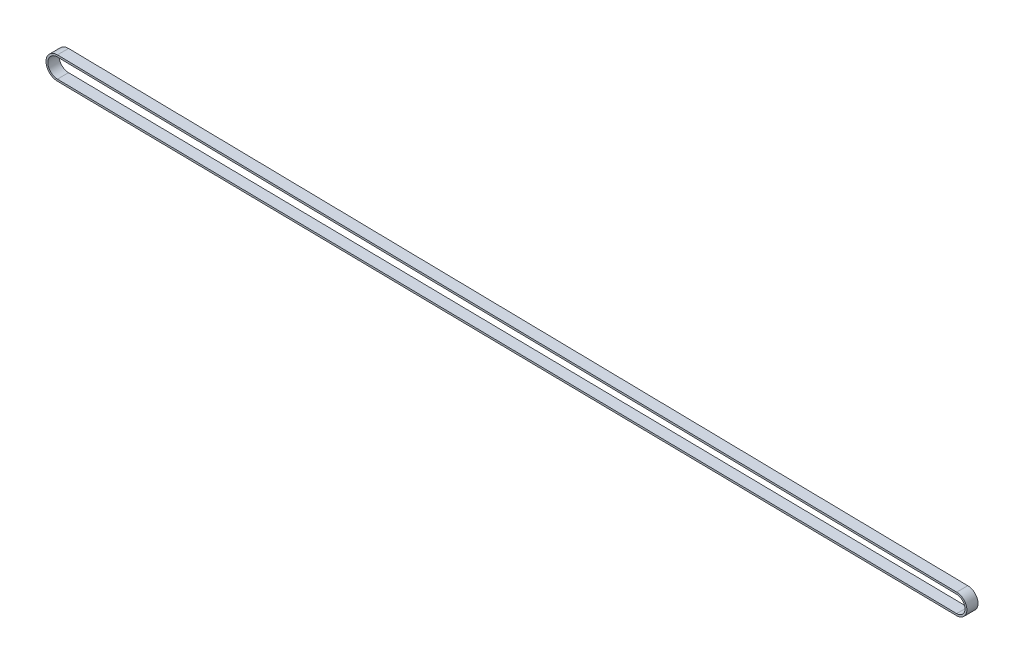
ISO-10303-21;
HEADER;
FILE_DESCRIPTION(('STEP AP214'),'2;1');
FILE_NAME('part.step','',(''),(''),'','','');
FILE_SCHEMA(('AUTOMOTIVE_DESIGN { 1 0 10303 214 1 1 1 1 }'));
ENDSEC;
DATA;
#1=APPLICATION_CONTEXT('core data for automotive mechanical design processes');
#2=APPLICATION_PROTOCOL_DEFINITION('international standard','automotive_design',2000,#1);
#3=PRODUCT_CONTEXT('',#1,'mechanical');
#4=PRODUCT('Part','Part','',(#3));
#5=PRODUCT_RELATED_PRODUCT_CATEGORY('part','',(#4));
#6=PRODUCT_DEFINITION_FORMATION('','',#4);
#7=PRODUCT_DEFINITION_CONTEXT('part definition',#1,'design');
#8=PRODUCT_DEFINITION('design','',#6,#7);
#9=PRODUCT_DEFINITION_SHAPE('','',#8);
#10=(LENGTH_UNIT() NAMED_UNIT(*) SI_UNIT(.MILLI.,.METRE.));
#11=(NAMED_UNIT(*) PLANE_ANGLE_UNIT() SI_UNIT($,.RADIAN.));
#12=(NAMED_UNIT(*) SI_UNIT($,.STERADIAN.) SOLID_ANGLE_UNIT());
#13=UNCERTAINTY_MEASURE_WITH_UNIT(LENGTH_MEASURE(1.E-05),#10,'distance_accuracy_value','');
#14=(GEOMETRIC_REPRESENTATION_CONTEXT(3) GLOBAL_UNCERTAINTY_ASSIGNED_CONTEXT((#13)) GLOBAL_UNIT_ASSIGNED_CONTEXT((#10,
#11,#12)) REPRESENTATION_CONTEXT('',''));
#15=CARTESIAN_POINT('',(0.,0.,0.));
#16=DIRECTION('',(0.,0.,1.));
#17=DIRECTION('',(1.,0.,0.));
#18=AXIS2_PLACEMENT_3D('',#15,#16,#17);
#19=CARTESIAN_POINT('',(-0.0908075609252351,-6.14865889240801,6.));
#20=DIRECTION('',(0.0147670672484752,0.999890960917679,0.));
#21=DIRECTION('',(-0.999890960917679,0.0147670672484752,0.));
#22=AXIS2_PLACEMENT_3D('',#19,#20,#21);
#23=PLANE('',#22);
#24=DIRECTION('',(0.999890960917679,-0.0147670672484752,0.));
#25=VECTOR('',#24,1.);
#26=CARTESIAN_POINT('',(-0.0908075609252351,-6.14865889240801,0.));
#27=LINE('',#26,#25);
#28=CARTESIAN_POINT('',(0.,-6.15,0.));
#29=VERTEX_POINT('',#28);
#30=CARTESIAN_POINT('',(483.926284690103,-13.2969512863332,0.));
#31=VERTEX_POINT('',#30);
#32=EDGE_CURVE('E142',#29,#31,#27,.T.);
#33=ORIENTED_EDGE('',*,*,#32,.T.);
#34=DIRECTION('',(0.,0.,-1.));
#35=VECTOR('',#34,1.);
#36=CARTESIAN_POINT('',(483.926284690103,-13.2969512863332,6.));
#37=LINE('',#36,#35);
#38=CARTESIAN_POINT('',(483.926284690103,-13.2969512863332,6.));
#39=VERTEX_POINT('',#38);
#40=EDGE_CURVE('E11',#39,#31,#37,.T.);
#41=ORIENTED_EDGE('',*,*,#40,.F.);
#42=DIRECTION('',(0.999890960917679,-0.0147670672484752,0.));
#43=VECTOR('',#42,1.);
#44=CARTESIAN_POINT('',(-0.0908075609252351,-6.14865889240801,6.));
#45=LINE('',#44,#43);
#46=CARTESIAN_POINT('',(0.,-6.15,6.));
#47=VERTEX_POINT('',#46);
#48=EDGE_CURVE('E116',#47,#39,#45,.T.);
#49=ORIENTED_EDGE('',*,*,#48,.F.);
#50=DIRECTION('',(0.,0.,-1.));
#51=VECTOR('',#50,1.);
#52=CARTESIAN_POINT('',(0.,-6.15,6.));
#53=LINE('',#52,#51);
#54=EDGE_CURVE('E149',#47,#29,#53,.T.);
#55=ORIENTED_EDGE('',*,*,#54,.T.);
#56=EDGE_LOOP('',(#33,#41,#49,#55));
#57=FACE_BOUND('',#56,.T.);
#58=ADVANCED_FACE('F35',(#57),#23,.F.);
#59=CARTESIAN_POINT('',(483.926284690103,-7.79695128633315,6.));
#60=DIRECTION('',(0.,0.,-1.));
#61=DIRECTION('',(-1.,0.,0.));
#62=AXIS2_PLACEMENT_3D('',#59,#60,#61);
#63=CYLINDRICAL_SURFACE('',#62,5.5);
#64=CARTESIAN_POINT('',(483.926284690103,-7.79695128633315,0.));
#65=DIRECTION('',(0.,0.,1.));
#66=DIRECTION('',(1.,0.,0.));
#67=AXIS2_PLACEMENT_3D('',#64,#65,#66);
#68=CIRCLE('',#67,5.5);
#69=CARTESIAN_POINT('',(483.926284690103,-2.29695128633315,0.));
#70=VERTEX_POINT('',#69);
#71=EDGE_CURVE('E121',#31,#70,#68,.T.);
#72=ORIENTED_EDGE('',*,*,#71,.T.);
#73=DIRECTION('',(0.,0.,-1.));
#74=VECTOR('',#73,1.);
#75=CARTESIAN_POINT('',(483.926284690103,-2.29695128633315,6.));
#76=LINE('',#75,#74);
#77=CARTESIAN_POINT('',(483.926284690103,-2.29695128633315,6.));
#78=VERTEX_POINT('',#77);
#79=EDGE_CURVE('E45',#78,#70,#76,.T.);
#80=ORIENTED_EDGE('',*,*,#79,.F.);
#81=CARTESIAN_POINT('',(483.926284690103,-7.79695128633315,6.));
#82=DIRECTION('',(0.,0.,1.));
#83=DIRECTION('',(1.,0.,0.));
#84=AXIS2_PLACEMENT_3D('',#81,#82,#83);
#85=CIRCLE('',#84,5.5);
#86=EDGE_CURVE('E110',#39,#78,#85,.T.);
#87=ORIENTED_EDGE('',*,*,#86,.F.);
#88=ORIENTED_EDGE('',*,*,#40,.T.);
#89=EDGE_LOOP('',(#72,#80,#87,#88));
#90=FACE_BOUND('',#89,.T.);
#91=ADVANCED_FACE('F120',(#90),#63,.T.);
#92=CARTESIAN_POINT('',(0.107315781797111,6.14812679903991,6.));
#93=DIRECTION('',(-0.017452378690771,-0.999847695640708,0.));
#94=DIRECTION('',(0.999847695640708,-0.017452378690771,0.));
#95=AXIS2_PLACEMENT_3D('',#92,#93,#94);
#96=PLANE('',#95);
#97=DIRECTION('',(-0.999847695640708,0.017452378690771,0.));
#98=VECTOR('',#97,1.);
#99=CARTESIAN_POINT('',(0.107315781797111,6.14812679903991,0.));
#100=LINE('',#99,#98);
#101=CARTESIAN_POINT('',(0.,6.15,0.));
#102=VERTEX_POINT('',#101);
#103=EDGE_CURVE('E83',#70,#102,#100,.T.);
#104=ORIENTED_EDGE('',*,*,#103,.T.);
#105=DIRECTION('',(0.,0.,-1.));
#106=VECTOR('',#105,1.);
#107=CARTESIAN_POINT('',(0.,6.15,6.));
#108=LINE('',#107,#106);
#109=CARTESIAN_POINT('',(0.,6.15,6.));
#110=VERTEX_POINT('',#109);
#111=EDGE_CURVE('E122',#110,#102,#108,.T.);
#112=ORIENTED_EDGE('',*,*,#111,.F.);
#113=DIRECTION('',(-0.999847695640708,0.017452378690771,0.));
#114=VECTOR('',#113,1.);
#115=CARTESIAN_POINT('',(0.107315781797111,6.14812679903991,6.));
#116=LINE('',#115,#114);
#117=EDGE_CURVE('E114',#78,#110,#116,.T.);
#118=ORIENTED_EDGE('',*,*,#117,.F.);
#119=ORIENTED_EDGE('',*,*,#79,.T.);
#120=EDGE_LOOP('',(#104,#112,#118,#119));
#121=FACE_BOUND('',#120,.T.);
#122=ADVANCED_FACE('F124',(#121),#96,.F.);
#123=CARTESIAN_POINT('',(483.926284690103,-7.79695128633315,6.));
#124=DIRECTION('',(0.,0.,-1.));
#125=DIRECTION('',(-1.,0.,0.));
#126=AXIS2_PLACEMENT_3D('',#123,#124,#125);
#127=CYLINDRICAL_SURFACE('',#126,4.5);
#128=CARTESIAN_POINT('',(483.926284690103,-7.79695128633315,0.));
#129=DIRECTION('',(0.,0.,1.));
#130=DIRECTION('',(1.,0.,0.));
#131=AXIS2_PLACEMENT_3D('',#128,#129,#130);
#132=CIRCLE('',#131,4.5);
#133=CARTESIAN_POINT('',(483.926284690103,-12.2969512863332,0.));
#134=VERTEX_POINT('',#133);
#135=CARTESIAN_POINT('',(483.926284690103,-3.29695128633315,0.));
#136=VERTEX_POINT('',#135);
#137=EDGE_CURVE('E130',#134,#136,#132,.T.);
#138=ORIENTED_EDGE('',*,*,#137,.F.);
#139=DIRECTION('',(0.,0.,-1.));
#140=VECTOR('',#139,1.);
#141=CARTESIAN_POINT('',(483.926284690103,-12.2969512863332,6.));
#142=LINE('',#141,#140);
#143=CARTESIAN_POINT('',(483.926284690103,-12.2969512863332,6.));
#144=VERTEX_POINT('',#143);
#145=EDGE_CURVE('E39',#144,#134,#142,.T.);
#146=ORIENTED_EDGE('',*,*,#145,.F.);
#147=CARTESIAN_POINT('',(483.926284690103,-7.79695128633315,6.));
#148=DIRECTION('',(0.,0.,1.));
#149=DIRECTION('',(1.,0.,0.));
#150=AXIS2_PLACEMENT_3D('',#147,#148,#149);
#151=CIRCLE('',#150,4.5);
#152=CARTESIAN_POINT('',(483.926284690103,-3.29695128633315,6.));
#153=VERTEX_POINT('',#152);
#154=EDGE_CURVE('E148',#144,#153,#151,.T.);
#155=ORIENTED_EDGE('',*,*,#154,.T.);
#156=DIRECTION('',(0.,0.,-1.));
#157=VECTOR('',#156,1.);
#158=CARTESIAN_POINT('',(483.926284690103,-3.29695128633315,6.));
#159=LINE('',#158,#157);
#160=EDGE_CURVE('E126',#153,#136,#159,.T.);
#161=ORIENTED_EDGE('',*,*,#160,.T.);
#162=EDGE_LOOP('',(#138,#146,#155,#161));
#163=FACE_BOUND('',#162,.T.);
#164=ADVANCED_FACE('F37',(#163),#127,.F.);
#165=CARTESIAN_POINT('',(-0.0760421038642213,-5.14887695868313,6.));
#166=DIRECTION('',(-0.0147670672484752,-0.999890960917679,0.));
#167=DIRECTION('',(0.999890960917679,-0.0147670672484752,0.));
#168=AXIS2_PLACEMENT_3D('',#165,#166,#167);
#169=PLANE('',#168);
#170=DIRECTION('',(-0.999890960917679,0.0147670672484752,0.));
#171=VECTOR('',#170,1.);
#172=CARTESIAN_POINT('',(-0.0760421038642213,-5.14887695868313,0.));
#173=LINE('',#172,#171);
#174=CARTESIAN_POINT('',(0.,-5.15,0.));
#175=VERTEX_POINT('',#174);
#176=EDGE_CURVE('E133',#134,#175,#173,.T.);
#177=ORIENTED_EDGE('',*,*,#176,.T.);
#178=DIRECTION('',(0.,0.,-1.));
#179=VECTOR('',#178,1.);
#180=CARTESIAN_POINT('',(0.,-5.15,6.));
#181=LINE('',#180,#179);
#182=CARTESIAN_POINT('',(0.,-5.15,6.));
#183=VERTEX_POINT('',#182);
#184=EDGE_CURVE('E154',#183,#175,#181,.T.);
#185=ORIENTED_EDGE('',*,*,#184,.F.);
#186=DIRECTION('',(-0.999890960917679,0.0147670672484752,0.));
#187=VECTOR('',#186,1.);
#188=CARTESIAN_POINT('',(-0.0760421038642213,-5.14887695868313,6.));
#189=LINE('',#188,#187);
#190=EDGE_CURVE('E162',#144,#183,#189,.T.);
#191=ORIENTED_EDGE('',*,*,#190,.F.);
#192=ORIENTED_EDGE('',*,*,#145,.T.);
#193=EDGE_LOOP('',(#177,#185,#191,#192));
#194=FACE_BOUND('',#193,.T.);
#195=ADVANCED_FACE('F161',(#194),#169,.F.);
#196=CARTESIAN_POINT('',(0.,0.,6.));
#197=DIRECTION('',(0.,0.,-1.));
#198=DIRECTION('',(-1.,0.,0.));
#199=AXIS2_PLACEMENT_3D('',#196,#197,#198);
#200=CYLINDRICAL_SURFACE('',#199,5.15);
#201=CARTESIAN_POINT('',(0.,0.,0.));
#202=DIRECTION('',(0.,0.,1.));
#203=DIRECTION('',(1.,0.,0.));
#204=AXIS2_PLACEMENT_3D('',#201,#202,#203);
#205=CIRCLE('',#204,5.15);
#206=CARTESIAN_POINT('',(0.179732122359378,5.14686276912375,0.));
#207=VERTEX_POINT('',#206);
#208=EDGE_CURVE('E136',#207,#175,#205,.T.);
#209=ORIENTED_EDGE('',*,*,#208,.F.);
#210=DIRECTION('',(0.,0.,-1.));
#211=VECTOR('',#210,1.);
#212=CARTESIAN_POINT('',(0.179732122359378,5.14686276912375,6.));
#213=LINE('',#212,#211);
#214=CARTESIAN_POINT('',(0.179732122359378,5.14686276912375,6.));
#215=VERTEX_POINT('',#214);
#216=EDGE_CURVE('E153',#215,#207,#213,.T.);
#217=ORIENTED_EDGE('',*,*,#216,.F.);
#218=CARTESIAN_POINT('',(0.,0.,6.));
#219=DIRECTION('',(0.,0.,1.));
#220=DIRECTION('',(1.,0.,0.));
#221=AXIS2_PLACEMENT_3D('',#218,#219,#220);
#222=CIRCLE('',#221,5.15);
#223=EDGE_CURVE('E174',#215,#183,#222,.T.);
#224=ORIENTED_EDGE('',*,*,#223,.T.);
#225=ORIENTED_EDGE('',*,*,#184,.T.);
#226=EDGE_LOOP('',(#209,#217,#224,#225));
#227=FACE_BOUND('',#226,.T.);
#228=ADVANCED_FACE('F172',(#227),#200,.F.);
#229=CARTESIAN_POINT('',(0.0898660611796943,5.14843138456188,6.));
#230=DIRECTION('',(0.017452378690771,0.999847695640708,0.));
#231=DIRECTION('',(-0.999847695640708,0.017452378690771,0.));
#232=AXIS2_PLACEMENT_3D('',#229,#230,#231);
#233=PLANE('',#232);
#234=DIRECTION('',(0.999847695640708,-0.017452378690771,0.));
#235=VECTOR('',#234,1.);
#236=CARTESIAN_POINT('',(0.0898660611796943,5.14843138456188,0.));
#237=LINE('',#236,#235);
#238=EDGE_CURVE('E139',#207,#136,#237,.T.);
#239=ORIENTED_EDGE('',*,*,#238,.T.);
#240=ORIENTED_EDGE('',*,*,#160,.F.);
#241=DIRECTION('',(0.999847695640708,-0.017452378690771,0.));
#242=VECTOR('',#241,1.);
#243=CARTESIAN_POINT('',(0.0898660611796943,5.14843138456188,6.));
#244=LINE('',#243,#242);
#245=EDGE_CURVE('E175',#215,#153,#244,.T.);
#246=ORIENTED_EDGE('',*,*,#245,.F.);
#247=ORIENTED_EDGE('',*,*,#216,.T.);
#248=EDGE_LOOP('',(#239,#240,#246,#247));
#249=FACE_BOUND('',#248,.T.);
#250=ADVANCED_FACE('F171',(#249),#233,.F.);
#251=CARTESIAN_POINT('',(0.,0.,6.));
#252=DIRECTION('',(0.,0.,-1.));
#253=DIRECTION('',(-1.,0.,0.));
#254=AXIS2_PLACEMENT_3D('',#251,#252,#253);
#255=CYLINDRICAL_SURFACE('',#254,6.15);
#256=CARTESIAN_POINT('',(0.,0.,0.));
#257=DIRECTION('',(0.,0.,1.));
#258=DIRECTION('',(1.,0.,0.));
#259=AXIS2_PLACEMENT_3D('',#256,#257,#258);
#260=CIRCLE('',#259,6.15);
#261=EDGE_CURVE('E89',#102,#29,#260,.T.);
#262=ORIENTED_EDGE('',*,*,#261,.T.);
#263=ORIENTED_EDGE('',*,*,#54,.F.);
#264=CARTESIAN_POINT('',(0.,0.,6.));
#265=DIRECTION('',(0.,0.,1.));
#266=DIRECTION('',(1.,0.,0.));
#267=AXIS2_PLACEMENT_3D('',#264,#265,#266);
#268=CIRCLE('',#267,6.15);
#269=EDGE_CURVE('E54',#110,#47,#268,.T.);
#270=ORIENTED_EDGE('',*,*,#269,.F.);
#271=ORIENTED_EDGE('',*,*,#111,.T.);
#272=EDGE_LOOP('',(#262,#263,#270,#271));
#273=FACE_BOUND('',#272,.T.);
#274=ADVANCED_FACE('F182',(#273),#255,.T.);
#275=CARTESIAN_POINT('',(0.,0.,6.));
#276=DIRECTION('',(0.,0.,1.));
#277=DIRECTION('',(1.,0.,0.));
#278=AXIS2_PLACEMENT_3D('',#275,#276,#277);
#279=PLANE('',#278);
#280=ORIENTED_EDGE('',*,*,#154,.F.);
#281=ORIENTED_EDGE('',*,*,#190,.T.);
#282=ORIENTED_EDGE('',*,*,#223,.F.);
#283=ORIENTED_EDGE('',*,*,#245,.T.);
#284=EDGE_LOOP('',(#280,#281,#282,#283));
#285=FACE_BOUND('',#284,.T.);
#286=ORIENTED_EDGE('',*,*,#48,.T.);
#287=ORIENTED_EDGE('',*,*,#86,.T.);
#288=ORIENTED_EDGE('',*,*,#117,.T.);
#289=ORIENTED_EDGE('',*,*,#269,.T.);
#290=EDGE_LOOP('',(#286,#287,#288,#289));
#291=FACE_BOUND('',#290,.T.);
#292=ADVANCED_FACE('F112',(#285,#291),#279,.T.);
#293=CARTESIAN_POINT('',(0.,0.,0.));
#294=DIRECTION('',(0.,0.,1.));
#295=DIRECTION('',(1.,0.,0.));
#296=AXIS2_PLACEMENT_3D('',#293,#294,#295);
#297=PLANE('',#296);
#298=ORIENTED_EDGE('',*,*,#137,.T.);
#299=ORIENTED_EDGE('',*,*,#238,.F.);
#300=ORIENTED_EDGE('',*,*,#208,.T.);
#301=ORIENTED_EDGE('',*,*,#176,.F.);
#302=EDGE_LOOP('',(#298,#299,#300,#301));
#303=FACE_BOUND('',#302,.T.);
#304=ORIENTED_EDGE('',*,*,#32,.F.);
#305=ORIENTED_EDGE('',*,*,#261,.F.);
#306=ORIENTED_EDGE('',*,*,#103,.F.);
#307=ORIENTED_EDGE('',*,*,#71,.F.);
#308=EDGE_LOOP('',(#304,#305,#306,#307));
#309=FACE_BOUND('',#308,.T.);
#310=ADVANCED_FACE('F165',(#303,#309),#297,.F.);
#311=CLOSED_SHELL('',(#58,#91,#122,#164,#195,#228,#250,#274,#292,#310));
#312=MANIFOLD_SOLID_BREP('B2',#311);
#313=ADVANCED_BREP_SHAPE_REPRESENTATION('',(#18,#312),#14);
#314=SHAPE_DEFINITION_REPRESENTATION(#9,#313);
ENDSEC;
END-ISO-10303-21;
